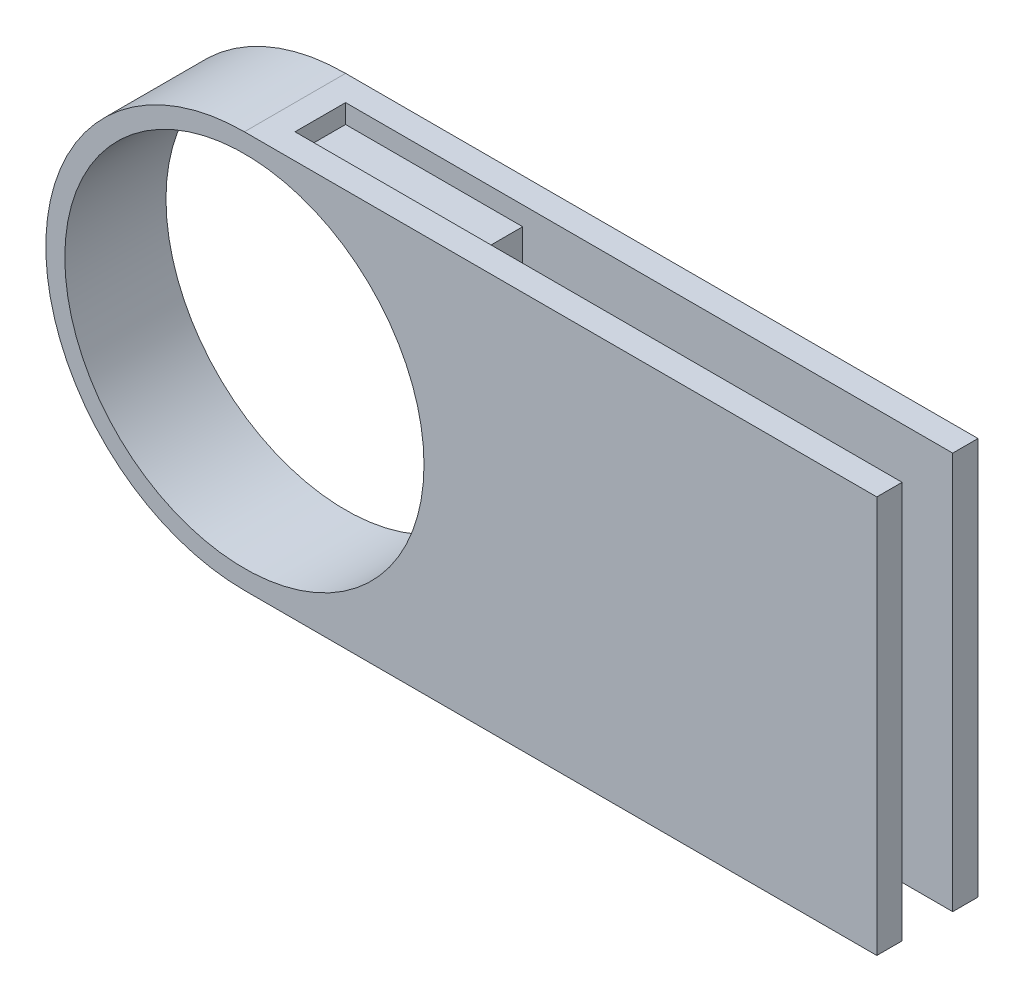
ISO-10303-21;
HEADER;
FILE_DESCRIPTION(('STEP AP214'),'2;1');
FILE_NAME('part.step','',(''),(''),'','','');
FILE_SCHEMA(('AUTOMOTIVE_DESIGN { 1 0 10303 214 1 1 1 1 }'));
ENDSEC;
DATA;
#1=APPLICATION_CONTEXT('core data for automotive mechanical design processes');
#2=APPLICATION_PROTOCOL_DEFINITION('international standard','automotive_design',2000,#1);
#3=PRODUCT_CONTEXT('',#1,'mechanical');
#4=PRODUCT('Part','Part','',(#3));
#5=PRODUCT_RELATED_PRODUCT_CATEGORY('part','',(#4));
#6=PRODUCT_DEFINITION_FORMATION('','',#4);
#7=PRODUCT_DEFINITION_CONTEXT('part definition',#1,'design');
#8=PRODUCT_DEFINITION('design','',#6,#7);
#9=PRODUCT_DEFINITION_SHAPE('','',#8);
#10=(LENGTH_UNIT() NAMED_UNIT(*) SI_UNIT(.MILLI.,.METRE.));
#11=(NAMED_UNIT(*) PLANE_ANGLE_UNIT() SI_UNIT($,.RADIAN.));
#12=(NAMED_UNIT(*) SI_UNIT($,.STERADIAN.) SOLID_ANGLE_UNIT());
#13=UNCERTAINTY_MEASURE_WITH_UNIT(LENGTH_MEASURE(1.E-05),#10,'distance_accuracy_value','');
#14=(GEOMETRIC_REPRESENTATION_CONTEXT(3) GLOBAL_UNCERTAINTY_ASSIGNED_CONTEXT((#13)) GLOBAL_UNIT_ASSIGNED_CONTEXT((#10,
#11,#12)) REPRESENTATION_CONTEXT('',''));
#15=CARTESIAN_POINT('',(0.,0.,0.));
#16=DIRECTION('',(0.,0.,1.));
#17=DIRECTION('',(1.,0.,0.));
#18=AXIS2_PLACEMENT_3D('',#15,#16,#17);
#19=CARTESIAN_POINT('',(63.5,-19.939,7.61999999999999));
#20=DIRECTION('',(0.,1.,0.));
#21=DIRECTION('',(0.,0.,1.));
#22=AXIS2_PLACEMENT_3D('',#19,#20,#21);
#23=PLANE('',#22);
#24=DIRECTION('',(-1.,0.,0.));
#25=VECTOR('',#24,1.);
#26=CARTESIAN_POINT('',(63.5,-19.939,5.08));
#27=LINE('',#26,#25);
#28=CARTESIAN_POINT('',(63.5,-19.939,5.08));
#29=VERTEX_POINT('',#28);
#30=CARTESIAN_POINT('',(20.32,-19.939,5.08));
#31=VERTEX_POINT('',#30);
#32=EDGE_CURVE('E159',#29,#31,#27,.T.);
#33=ORIENTED_EDGE('',*,*,#32,.F.);
#34=DIRECTION('',(0.,0.,-1.));
#35=VECTOR('',#34,1.);
#36=CARTESIAN_POINT('',(63.5,-19.939,7.61999999999999));
#37=LINE('',#36,#35);
#38=CARTESIAN_POINT('',(63.5,-19.939,7.61999999999999));
#39=VERTEX_POINT('',#38);
#40=EDGE_CURVE('E185',#39,#29,#37,.T.);
#41=ORIENTED_EDGE('',*,*,#40,.F.);
#42=DIRECTION('',(-1.,0.,0.));
#43=VECTOR('',#42,1.);
#44=CARTESIAN_POINT('',(63.5,-19.939,7.61999999999999));
#45=LINE('',#44,#43);
#46=CARTESIAN_POINT('',(0.,-19.939,7.62));
#47=VERTEX_POINT('',#46);
#48=EDGE_CURVE('E43',#39,#47,#45,.T.);
#49=ORIENTED_EDGE('',*,*,#48,.T.);
#50=DIRECTION('',(0.,0.,-1.));
#51=VECTOR('',#50,1.);
#52=CARTESIAN_POINT('',(0.,-19.939,7.61999999999999));
#53=LINE('',#52,#51);
#54=CARTESIAN_POINT('',(0.,-19.939,-2.54));
#55=VERTEX_POINT('',#54);
#56=EDGE_CURVE('E179',#47,#55,#53,.T.);
#57=ORIENTED_EDGE('',*,*,#56,.T.);
#58=DIRECTION('',(-1.,0.,0.));
#59=VECTOR('',#58,1.);
#60=CARTESIAN_POINT('',(63.5,-19.939,-2.54));
#61=LINE('',#60,#59);
#62=CARTESIAN_POINT('',(63.5,-19.939,-2.54));
#63=VERTEX_POINT('',#62);
#64=EDGE_CURVE('E173',#63,#55,#61,.T.);
#65=ORIENTED_EDGE('',*,*,#64,.F.);
#66=CARTESIAN_POINT('',(63.5,-19.939,0.));
#67=VERTEX_POINT('',#66);
#68=EDGE_CURVE('E183',#67,#63,#37,.T.);
#69=ORIENTED_EDGE('',*,*,#68,.F.);
#70=DIRECTION('',(-1.,0.,0.));
#71=VECTOR('',#70,1.);
#72=CARTESIAN_POINT('',(63.5,-19.939,0.));
#73=LINE('',#72,#71);
#74=CARTESIAN_POINT('',(20.32,-19.939,0.));
#75=VERTEX_POINT('',#74);
#76=EDGE_CURVE('E58',#67,#75,#73,.T.);
#77=ORIENTED_EDGE('',*,*,#76,.T.);
#78=DIRECTION('',(0.,0.,-1.));
#79=VECTOR('',#78,1.);
#80=CARTESIAN_POINT('',(20.32,-19.939,0.));
#81=LINE('',#80,#79);
#82=EDGE_CURVE('E151',#31,#75,#81,.T.);
#83=ORIENTED_EDGE('',*,*,#82,.F.);
#84=EDGE_LOOP('',(#33,#41,#49,#57,#65,#69,#77,#83));
#85=FACE_BOUND('',#84,.T.);
#86=ADVANCED_FACE('F35',(#85),#23,.F.);
#87=CARTESIAN_POINT('',(63.5,19.939,7.62));
#88=DIRECTION('',(0.,-1.,0.));
#89=DIRECTION('',(0.,0.,-1.));
#90=AXIS2_PLACEMENT_3D('',#87,#88,#89);
#91=PLANE('',#90);
#92=DIRECTION('',(-1.,0.,0.));
#93=VECTOR('',#92,1.);
#94=CARTESIAN_POINT('',(63.5,19.939,5.08));
#95=LINE('',#94,#93);
#96=CARTESIAN_POINT('',(63.5,19.939,5.08));
#97=VERTEX_POINT('',#96);
#98=CARTESIAN_POINT('',(2.54,19.939,5.08));
#99=VERTEX_POINT('',#98);
#100=EDGE_CURVE('E149',#97,#99,#95,.T.);
#101=ORIENTED_EDGE('',*,*,#100,.T.);
#102=DIRECTION('',(0.,0.,1.));
#103=VECTOR('',#102,1.);
#104=CARTESIAN_POINT('',(2.54,19.939,5.08));
#105=LINE('',#104,#103);
#106=CARTESIAN_POINT('',(2.54,19.939,0.));
#107=VERTEX_POINT('',#106);
#108=EDGE_CURVE('E121',#107,#99,#105,.T.);
#109=ORIENTED_EDGE('',*,*,#108,.F.);
#110=DIRECTION('',(-1.,0.,0.));
#111=VECTOR('',#110,1.);
#112=CARTESIAN_POINT('',(63.5,19.939,0.));
#113=LINE('',#112,#111);
#114=CARTESIAN_POINT('',(63.5,19.939,0.));
#115=VERTEX_POINT('',#114);
#116=EDGE_CURVE('E156',#115,#107,#113,.T.);
#117=ORIENTED_EDGE('',*,*,#116,.F.);
#118=DIRECTION('',(0.,0.,1.));
#119=VECTOR('',#118,1.);
#120=CARTESIAN_POINT('',(63.5,19.939,7.62));
#121=LINE('',#120,#119);
#122=CARTESIAN_POINT('',(63.5,19.939,-2.54));
#123=VERTEX_POINT('',#122);
#124=EDGE_CURVE('E189',#123,#115,#121,.T.);
#125=ORIENTED_EDGE('',*,*,#124,.F.);
#126=DIRECTION('',(1.,0.,0.));
#127=VECTOR('',#126,1.);
#128=CARTESIAN_POINT('',(0.,19.939,-2.54));
#129=LINE('',#128,#127);
#130=CARTESIAN_POINT('',(0.,19.939,-2.54));
#131=VERTEX_POINT('',#130);
#132=EDGE_CURVE('E167',#131,#123,#129,.T.);
#133=ORIENTED_EDGE('',*,*,#132,.F.);
#134=DIRECTION('',(0.,0.,1.));
#135=VECTOR('',#134,1.);
#136=CARTESIAN_POINT('',(0.,19.939,7.62));
#137=LINE('',#136,#135);
#138=CARTESIAN_POINT('',(0.,19.939,7.62));
#139=VERTEX_POINT('',#138);
#140=EDGE_CURVE('E184',#131,#139,#137,.T.);
#141=ORIENTED_EDGE('',*,*,#140,.T.);
#142=DIRECTION('',(-1.,0.,0.));
#143=VECTOR('',#142,1.);
#144=CARTESIAN_POINT('',(63.5,19.939,7.62));
#145=LINE('',#144,#143);
#146=CARTESIAN_POINT('',(63.5,19.939,7.62));
#147=VERTEX_POINT('',#146);
#148=EDGE_CURVE('E192',#147,#139,#145,.T.);
#149=ORIENTED_EDGE('',*,*,#148,.F.);
#150=EDGE_CURVE('E188',#97,#147,#121,.T.);
#151=ORIENTED_EDGE('',*,*,#150,.F.);
#152=EDGE_LOOP('',(#101,#109,#117,#125,#133,#141,#149,#151));
#153=FACE_BOUND('',#152,.T.);
#154=ADVANCED_FACE('F210',(#153),#91,.F.);
#155=CARTESIAN_POINT('',(63.5,0.,0.));
#156=DIRECTION('',(1.,0.,0.));
#157=DIRECTION('',(0.,0.,-1.));
#158=AXIS2_PLACEMENT_3D('',#155,#156,#157);
#159=PLANE('',#158);
#160=ORIENTED_EDGE('',*,*,#40,.T.);
#161=DIRECTION('',(0.,-1.,0.));
#162=VECTOR('',#161,1.);
#163=CARTESIAN_POINT('',(63.5,-19.939,5.08));
#164=LINE('',#163,#162);
#165=EDGE_CURVE('E144',#97,#29,#164,.T.);
#166=ORIENTED_EDGE('',*,*,#165,.F.);
#167=ORIENTED_EDGE('',*,*,#150,.T.);
#168=DIRECTION('',(0.,-1.,0.));
#169=VECTOR('',#168,1.);
#170=CARTESIAN_POINT('',(63.5,19.939,7.62));
#171=LINE('',#170,#169);
#172=EDGE_CURVE('E180',#147,#39,#171,.T.);
#173=ORIENTED_EDGE('',*,*,#172,.T.);
#174=EDGE_LOOP('',(#160,#166,#167,#173));
#175=FACE_BOUND('',#174,.T.);
#176=ADVANCED_FACE('F223',(#175),#159,.T.);
#177=ORIENTED_EDGE('',*,*,#124,.T.);
#178=DIRECTION('',(0.,1.,0.));
#179=VECTOR('',#178,1.);
#180=CARTESIAN_POINT('',(63.5,-19.939,0.));
#181=LINE('',#180,#179);
#182=EDGE_CURVE('E146',#67,#115,#181,.T.);
#183=ORIENTED_EDGE('',*,*,#182,.F.);
#184=ORIENTED_EDGE('',*,*,#68,.T.);
#185=DIRECTION('',(0.,-1.,0.));
#186=VECTOR('',#185,1.);
#187=CARTESIAN_POINT('',(63.5,19.939,-2.54));
#188=LINE('',#187,#186);
#189=EDGE_CURVE('E170',#123,#63,#188,.T.);
#190=ORIENTED_EDGE('',*,*,#189,.F.);
#191=EDGE_LOOP('',(#177,#183,#184,#190));
#192=FACE_BOUND('',#191,.T.);
#193=ADVANCED_FACE('F219',(#192),#159,.T.);
#194=CARTESIAN_POINT('',(0.,0.,7.62));
#195=DIRECTION('',(0.,0.,-1.));
#196=DIRECTION('',(-1.,0.,0.));
#197=AXIS2_PLACEMENT_3D('',#194,#195,#196);
#198=CYLINDRICAL_SURFACE('',#197,19.939);
#199=ORIENTED_EDGE('',*,*,#56,.F.);
#200=CARTESIAN_POINT('',(0.,0.,7.62));
#201=DIRECTION('',(0.,0.,1.));
#202=DIRECTION('',(1.,0.,0.));
#203=AXIS2_PLACEMENT_3D('',#200,#201,#202);
#204=CIRCLE('',#203,19.939);
#205=EDGE_CURVE('E11',#139,#47,#204,.T.);
#206=ORIENTED_EDGE('',*,*,#205,.F.);
#207=ORIENTED_EDGE('',*,*,#140,.F.);
#208=CARTESIAN_POINT('',(0.,0.,-2.54));
#209=DIRECTION('',(0.,0.,-1.));
#210=DIRECTION('',(-1.,0.,0.));
#211=AXIS2_PLACEMENT_3D('',#208,#209,#210);
#212=CIRCLE('',#211,19.939);
#213=EDGE_CURVE('E164',#55,#131,#212,.T.);
#214=ORIENTED_EDGE('',*,*,#213,.F.);
#215=EDGE_LOOP('',(#199,#206,#207,#214));
#216=FACE_BOUND('',#215,.T.);
#217=ADVANCED_FACE('F37',(#216),#198,.T.);
#218=CARTESIAN_POINT('',(0.,0.,7.62));
#219=DIRECTION('',(0.,0.,1.));
#220=DIRECTION('',(1.,0.,0.));
#221=AXIS2_PLACEMENT_3D('',#218,#219,#220);
#222=PLANE('',#221);
#223=CARTESIAN_POINT('',(0.,0.,7.62));
#224=DIRECTION('',(0.,0.,1.));
#225=DIRECTION('',(1.,0.,0.));
#226=AXIS2_PLACEMENT_3D('',#223,#224,#225);
#227=CIRCLE('',#226,18.034);
#228=CARTESIAN_POINT('',(18.034,0.,7.62));
#229=VERTEX_POINT('',#228);
#230=EDGE_CURVE('E176',#229,#229,#227,.T.);
#231=ORIENTED_EDGE('',*,*,#230,.F.);
#232=EDGE_LOOP('',(#231));
#233=FACE_BOUND('',#232,.T.);
#234=ORIENTED_EDGE('',*,*,#205,.T.);
#235=ORIENTED_EDGE('',*,*,#48,.F.);
#236=ORIENTED_EDGE('',*,*,#172,.F.);
#237=ORIENTED_EDGE('',*,*,#148,.T.);
#238=EDGE_LOOP('',(#234,#235,#236,#237));
#239=FACE_BOUND('',#238,.T.);
#240=ADVANCED_FACE('F204',(#233,#239),#222,.T.);
#241=CARTESIAN_POINT('',(0.,0.,0.));
#242=DIRECTION('',(0.,0.,1.));
#243=DIRECTION('',(1.,0.,0.));
#244=AXIS2_PLACEMENT_3D('',#241,#242,#243);
#245=CYLINDRICAL_SURFACE('',#244,18.034);
#246=CARTESIAN_POINT('',(0.,0.,-2.54));
#247=DIRECTION('',(0.,0.,1.));
#248=DIRECTION('',(1.,0.,0.));
#249=AXIS2_PLACEMENT_3D('',#246,#247,#248);
#250=CIRCLE('',#249,18.034);
#251=CARTESIAN_POINT('',(18.034,0.,-2.54));
#252=VERTEX_POINT('',#251);
#253=EDGE_CURVE('E161',#252,#252,#250,.T.);
#254=CARTESIAN_POINT('',(18.034,0.,7.62));
#255=CARTESIAN_POINT('',(18.034,0.,7.51416666666667));
#256=CARTESIAN_POINT('',(18.034,0.,7.40833333333333));
#257=CARTESIAN_POINT('',(18.034,0.,7.19666666666667));
#258=CARTESIAN_POINT('',(18.034,0.,7.09083333333333));
#259=CARTESIAN_POINT('',(18.034,0.,6.87916666666667));
#260=CARTESIAN_POINT('',(18.034,0.,6.77333333333333));
#261=CARTESIAN_POINT('',(18.034,0.,6.56166666666667));
#262=CARTESIAN_POINT('',(18.034,0.,6.45583333333333));
#263=CARTESIAN_POINT('',(18.034,0.,6.24416666666666));
#264=CARTESIAN_POINT('',(18.034,0.,6.13833333333333));
#265=CARTESIAN_POINT('',(18.034,0.,5.92666666666666));
#266=CARTESIAN_POINT('',(18.034,0.,5.82083333333333));
#267=CARTESIAN_POINT('',(18.034,0.,5.60916666666667));
#268=CARTESIAN_POINT('',(18.034,0.,5.50333333333333));
#269=CARTESIAN_POINT('',(18.034,0.,5.29166666666667));
#270=CARTESIAN_POINT('',(18.034,0.,5.18583333333333));
#271=CARTESIAN_POINT('',(18.034,0.,4.97416666666667));
#272=CARTESIAN_POINT('',(18.034,0.,4.86833333333333));
#273=CARTESIAN_POINT('',(18.034,0.,4.65666666666666));
#274=CARTESIAN_POINT('',(18.034,0.,4.55083333333333));
#275=CARTESIAN_POINT('',(18.034,0.,4.33916666666666));
#276=CARTESIAN_POINT('',(18.034,0.,4.23333333333333));
#277=CARTESIAN_POINT('',(18.034,0.,4.02166666666667));
#278=CARTESIAN_POINT('',(18.034,0.,3.91583333333333));
#279=CARTESIAN_POINT('',(18.034,0.,3.70416666666667));
#280=CARTESIAN_POINT('',(18.034,0.,3.59833333333333));
#281=CARTESIAN_POINT('',(18.034,0.,3.38666666666667));
#282=CARTESIAN_POINT('',(18.034,0.,3.28083333333333));
#283=CARTESIAN_POINT('',(18.034,0.,3.06916666666667));
#284=CARTESIAN_POINT('',(18.034,0.,2.96333333333333));
#285=CARTESIAN_POINT('',(18.034,0.,2.75166666666667));
#286=CARTESIAN_POINT('',(18.034,0.,2.64583333333333));
#287=CARTESIAN_POINT('',(18.034,0.,2.43416666666667));
#288=CARTESIAN_POINT('',(18.034,0.,2.32833333333333));
#289=CARTESIAN_POINT('',(18.034,0.,2.11666666666667));
#290=CARTESIAN_POINT('',(18.034,0.,2.01083333333333));
#291=CARTESIAN_POINT('',(18.034,0.,1.79916666666667));
#292=CARTESIAN_POINT('',(18.034,0.,1.69333333333333));
#293=CARTESIAN_POINT('',(18.034,0.,1.48166666666667));
#294=CARTESIAN_POINT('',(18.034,0.,1.37583333333333));
#295=CARTESIAN_POINT('',(18.034,0.,1.16416666666667));
#296=CARTESIAN_POINT('',(18.034,0.,1.05833333333333));
#297=CARTESIAN_POINT('',(18.034,0.,0.846666666666666));
#298=CARTESIAN_POINT('',(18.034,0.,0.740833333333332));
#299=CARTESIAN_POINT('',(18.034,0.,0.529166666666666));
#300=CARTESIAN_POINT('',(18.034,0.,0.423333333333332));
#301=CARTESIAN_POINT('',(18.034,0.,0.211666666666666));
#302=CARTESIAN_POINT('',(18.034,0.,0.105833333333333));
#303=CARTESIAN_POINT('',(18.034,0.,-0.105833333333333));
#304=CARTESIAN_POINT('',(18.034,0.,-0.211666666666667));
#305=CARTESIAN_POINT('',(18.034,0.,-0.423333333333333));
#306=CARTESIAN_POINT('',(18.034,0.,-0.529166666666667));
#307=CARTESIAN_POINT('',(18.034,0.,-0.740833333333333));
#308=CARTESIAN_POINT('',(18.034,0.,-0.846666666666667));
#309=CARTESIAN_POINT('',(18.034,0.,-1.05833333333333));
#310=CARTESIAN_POINT('',(18.034,0.,-1.16416666666667));
#311=CARTESIAN_POINT('',(18.034,0.,-1.37583333333333));
#312=CARTESIAN_POINT('',(18.034,0.,-1.48166666666667));
#313=CARTESIAN_POINT('',(18.034,0.,-1.69333333333333));
#314=CARTESIAN_POINT('',(18.034,0.,-1.79916666666667));
#315=CARTESIAN_POINT('',(18.034,0.,-2.01083333333333));
#316=CARTESIAN_POINT('',(18.034,0.,-2.11666666666667));
#317=CARTESIAN_POINT('',(18.034,0.,-2.32833333333333));
#318=CARTESIAN_POINT('',(18.034,0.,-2.43416666666667));
#319=CARTESIAN_POINT('',(18.034,0.,-2.54));
#320=B_SPLINE_CURVE_WITH_KNOTS('',3,(#254,#255,#256,#257,#258,#259,#260,#261,#262,#263,#264,
#265,#266,#267,#268,#269,#270,#271,#272,#273,#274,#275,#276,#277,#278,#279,#280,#281,#282,#283,
#284,#285,#286,#287,#288,#289,#290,#291,#292,#293,#294,#295,#296,#297,#298,#299,#300,#301,#302,
#303,#304,#305,#306,#307,#308,#309,#310,#311,#312,#313,#314,#315,#316,#317,#318,#319),
.UNSPECIFIED.,.F.,.F.,(4,2,2,2,2,2,2,2,2,2,2,2,2,2,2,2,2,2,2,2,2,2,2,2,2,2,2,2,2,2,2,2,4),(0.,
0.3175,0.635,0.9525,1.27,1.5875,1.905,2.2225,2.54,2.8575,3.175,3.4925,3.81,4.1275,4.445,4.7625,
5.08,5.3975,5.715,6.0325,6.35,6.6675,6.985,7.3025,7.62,7.9375,8.255,8.5725,8.89,9.2075,9.525,
9.8425,10.16),.UNSPECIFIED.);
#321=EDGE_CURVE('BSEAM237',#229,#252,#320,.T.);
#322=ORIENTED_EDGE('',*,*,#230,.T.);
#323=ORIENTED_EDGE('',*,*,#253,.F.);
#324=ORIENTED_EDGE('',*,*,#321,.T.);
#325=ORIENTED_EDGE('',*,*,#321,.F.);
#326=EDGE_LOOP('',(#322,#324,#323,#325));
#327=FACE_BOUND('',#326,.T.);
#328=ADVANCED_FACE('F237',(#327),#245,.F.);
#329=CARTESIAN_POINT('',(0.,0.,-2.54));
#330=DIRECTION('',(0.,0.,-1.));
#331=DIRECTION('',(-1.,0.,0.));
#332=AXIS2_PLACEMENT_3D('',#329,#330,#331);
#333=PLANE('',#332);
#334=ORIENTED_EDGE('',*,*,#253,.T.);
#335=EDGE_LOOP('',(#334));
#336=FACE_BOUND('',#335,.T.);
#337=ORIENTED_EDGE('',*,*,#213,.T.);
#338=ORIENTED_EDGE('',*,*,#132,.T.);
#339=ORIENTED_EDGE('',*,*,#189,.T.);
#340=ORIENTED_EDGE('',*,*,#64,.T.);
#341=EDGE_LOOP('',(#337,#338,#339,#340));
#342=FACE_BOUND('',#341,.T.);
#343=ADVANCED_FACE('F215',(#336,#342),#333,.T.);
#344=CARTESIAN_POINT('',(63.5,-19.939,5.08));
#345=DIRECTION('',(0.,0.,-1.));
#346=DIRECTION('',(-1.,0.,0.));
#347=AXIS2_PLACEMENT_3D('',#344,#345,#346);
#348=PLANE('',#347);
#349=DIRECTION('',(0.,-1.,0.));
#350=VECTOR('',#349,1.);
#351=CARTESIAN_POINT('',(20.32,-19.939,5.08));
#352=LINE('',#351,#350);
#353=CARTESIAN_POINT('',(20.32,18.034,5.08));
#354=VERTEX_POINT('',#353);
#355=EDGE_CURVE('E119',#354,#31,#352,.T.);
#356=ORIENTED_EDGE('',*,*,#355,.F.);
#357=DIRECTION('',(1.,0.,0.));
#358=VECTOR('',#357,1.);
#359=CARTESIAN_POINT('',(2.54,18.034,5.08));
#360=LINE('',#359,#358);
#361=CARTESIAN_POINT('',(2.54,18.034,5.08));
#362=VERTEX_POINT('',#361);
#363=EDGE_CURVE('E50',#362,#354,#360,.T.);
#364=ORIENTED_EDGE('',*,*,#363,.F.);
#365=DIRECTION('',(0.,-1.,0.));
#366=VECTOR('',#365,1.);
#367=CARTESIAN_POINT('',(2.54,19.939,5.08));
#368=LINE('',#367,#366);
#369=EDGE_CURVE('E116',#99,#362,#368,.T.);
#370=ORIENTED_EDGE('',*,*,#369,.F.);
#371=ORIENTED_EDGE('',*,*,#100,.F.);
#372=ORIENTED_EDGE('',*,*,#165,.T.);
#373=ORIENTED_EDGE('',*,*,#32,.T.);
#374=EDGE_LOOP('',(#356,#364,#370,#371,#372,#373));
#375=FACE_BOUND('',#374,.T.);
#376=ADVANCED_FACE('F114',(#375),#348,.T.);
#377=CARTESIAN_POINT('',(63.5,-19.939,0.));
#378=DIRECTION('',(0.,0.,1.));
#379=DIRECTION('',(1.,0.,0.));
#380=AXIS2_PLACEMENT_3D('',#377,#378,#379);
#381=PLANE('',#380);
#382=DIRECTION('',(0.,1.,0.));
#383=VECTOR('',#382,1.);
#384=CARTESIAN_POINT('',(20.32,-19.939,0.));
#385=LINE('',#384,#383);
#386=CARTESIAN_POINT('',(20.32,18.034,0.));
#387=VERTEX_POINT('',#386);
#388=EDGE_CURVE('E147',#75,#387,#385,.T.);
#389=ORIENTED_EDGE('',*,*,#388,.F.);
#390=ORIENTED_EDGE('',*,*,#76,.F.);
#391=ORIENTED_EDGE('',*,*,#182,.T.);
#392=ORIENTED_EDGE('',*,*,#116,.T.);
#393=DIRECTION('',(0.,1.,0.));
#394=VECTOR('',#393,1.);
#395=CARTESIAN_POINT('',(2.54,19.939,0.));
#396=LINE('',#395,#394);
#397=CARTESIAN_POINT('',(2.54,18.034,0.));
#398=VERTEX_POINT('',#397);
#399=EDGE_CURVE('E129',#398,#107,#396,.T.);
#400=ORIENTED_EDGE('',*,*,#399,.F.);
#401=DIRECTION('',(1.,0.,0.));
#402=VECTOR('',#401,1.);
#403=CARTESIAN_POINT('',(2.54,18.034,0.));
#404=LINE('',#403,#402);
#405=EDGE_CURVE('E120',#398,#387,#404,.T.);
#406=ORIENTED_EDGE('',*,*,#405,.T.);
#407=EDGE_LOOP('',(#389,#390,#391,#392,#400,#406));
#408=FACE_BOUND('',#407,.T.);
#409=ADVANCED_FACE('F220',(#408),#381,.T.);
#410=CARTESIAN_POINT('',(20.32,0.,0.));
#411=DIRECTION('',(1.,0.,0.));
#412=DIRECTION('',(0.,0.,-1.));
#413=AXIS2_PLACEMENT_3D('',#410,#411,#412);
#414=PLANE('',#413);
#415=CARTESIAN_POINT('',(20.32,0.,2.54));
#416=DIRECTION('',(1.,0.,0.));
#417=DIRECTION('',(0.,0.,-1.));
#418=AXIS2_PLACEMENT_3D('',#415,#416,#417);
#419=CIRCLE('',#418,1.905);
#420=CARTESIAN_POINT('',(20.32,0.,0.635));
#421=VERTEX_POINT('',#420);
#422=EDGE_CURVE('E138',#421,#421,#419,.T.);
#423=ORIENTED_EDGE('',*,*,#422,.F.);
#424=EDGE_LOOP('',(#423));
#425=FACE_BOUND('',#424,.T.);
#426=DIRECTION('',(0.,0.,-1.));
#427=VECTOR('',#426,1.);
#428=CARTESIAN_POINT('',(20.32,18.034,5.08));
#429=LINE('',#428,#427);
#430=EDGE_CURVE('E133',#354,#387,#429,.T.);
#431=ORIENTED_EDGE('',*,*,#430,.F.);
#432=ORIENTED_EDGE('',*,*,#355,.T.);
#433=ORIENTED_EDGE('',*,*,#82,.T.);
#434=ORIENTED_EDGE('',*,*,#388,.T.);
#435=EDGE_LOOP('',(#431,#432,#433,#434));
#436=FACE_BOUND('',#435,.T.);
#437=ADVANCED_FACE('F257',(#425,#436),#414,.T.);
#438=CARTESIAN_POINT('',(2.54,18.034,5.08));
#439=DIRECTION('',(0.,-1.,0.));
#440=DIRECTION('',(0.,0.,-1.));
#441=AXIS2_PLACEMENT_3D('',#438,#439,#440);
#442=PLANE('',#441);
#443=ORIENTED_EDGE('',*,*,#430,.T.);
#444=ORIENTED_EDGE('',*,*,#405,.F.);
#445=DIRECTION('',(0.,0.,-1.));
#446=VECTOR('',#445,1.);
#447=CARTESIAN_POINT('',(2.54,18.034,5.08));
#448=LINE('',#447,#446);
#449=EDGE_CURVE('E124',#362,#398,#448,.T.);
#450=ORIENTED_EDGE('',*,*,#449,.F.);
#451=ORIENTED_EDGE('',*,*,#363,.T.);
#452=EDGE_LOOP('',(#443,#444,#450,#451));
#453=FACE_BOUND('',#452,.T.);
#454=ADVANCED_FACE('F125',(#453),#442,.F.);
#455=CARTESIAN_POINT('',(2.54,0.,0.));
#456=DIRECTION('',(1.,0.,0.));
#457=DIRECTION('',(0.,0.,-1.));
#458=AXIS2_PLACEMENT_3D('',#455,#456,#457);
#459=PLANE('',#458);
#460=ORIENTED_EDGE('',*,*,#369,.T.);
#461=ORIENTED_EDGE('',*,*,#449,.T.);
#462=ORIENTED_EDGE('',*,*,#399,.T.);
#463=ORIENTED_EDGE('',*,*,#108,.T.);
#464=EDGE_LOOP('',(#460,#461,#462,#463));
#465=FACE_BOUND('',#464,.T.);
#466=ADVANCED_FACE('F131',(#465),#459,.T.);
#467=CARTESIAN_POINT('',(22.86,0.,2.54));
#468=DIRECTION('',(-1.,0.,0.));
#469=DIRECTION('',(0.,0.,1.));
#470=AXIS2_PLACEMENT_3D('',#467,#468,#469);
#471=CYLINDRICAL_SURFACE('',#470,1.905);
#472=CARTESIAN_POINT('',(22.86,0.,2.54));
#473=DIRECTION('',(1.,0.,0.));
#474=DIRECTION('',(0.,0.,-1.));
#475=AXIS2_PLACEMENT_3D('',#472,#473,#474);
#476=CIRCLE('',#475,1.905);
#477=CARTESIAN_POINT('',(22.86,0.,0.635));
#478=VERTEX_POINT('',#477);
#479=EDGE_CURVE('E135',#478,#478,#476,.T.);
#480=ORIENTED_EDGE('',*,*,#479,.F.);
#481=EDGE_LOOP('',(#480));
#482=FACE_BOUND('',#481,.T.);
#483=ORIENTED_EDGE('',*,*,#422,.T.);
#484=EDGE_LOOP('',(#483));
#485=FACE_BOUND('',#484,.T.);
#486=ADVANCED_FACE('F265',(#482,#485),#471,.T.);
#487=CARTESIAN_POINT('',(22.86,0.,2.54));
#488=DIRECTION('',(1.,0.,0.));
#489=DIRECTION('',(0.,0.,-1.));
#490=AXIS2_PLACEMENT_3D('',#487,#488,#489);
#491=PLANE('',#490);
#492=ORIENTED_EDGE('',*,*,#479,.T.);
#493=EDGE_LOOP('',(#492));
#494=FACE_BOUND('',#493,.T.);
#495=ADVANCED_FACE('F268',(#494),#491,.T.);
#496=CLOSED_SHELL('',(#86,#154,#176,#193,#217,#240,#328,#343,#376,#409,#437,#454,#466,#486,#495));
#497=MANIFOLD_SOLID_BREP('B2',#496);
#498=ADVANCED_BREP_SHAPE_REPRESENTATION('',(#18,#497),#14);
#499=SHAPE_DEFINITION_REPRESENTATION(#9,#498);
ENDSEC;
END-ISO-10303-21;
